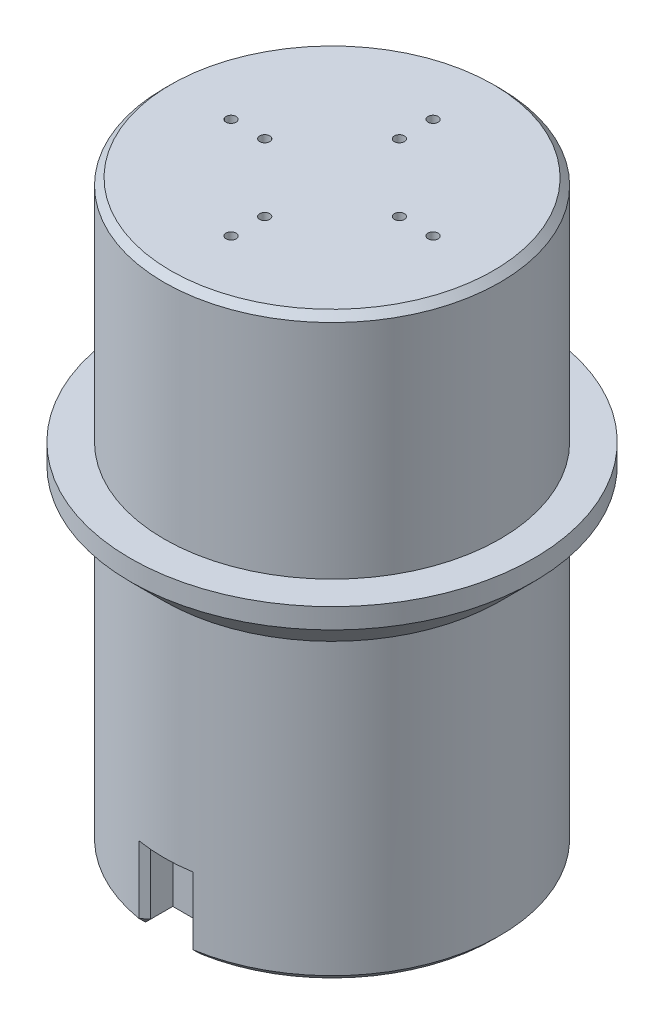
ISO-10303-21;
HEADER;
FILE_DESCRIPTION(('STEP AP214'),'2;1');
FILE_NAME('part.step','',(''),(''),'','','');
FILE_SCHEMA(('AUTOMOTIVE_DESIGN { 1 0 10303 214 1 1 1 1 }'));
ENDSEC;
DATA;
#1=APPLICATION_CONTEXT('core data for automotive mechanical design processes');
#2=APPLICATION_PROTOCOL_DEFINITION('international standard','automotive_design',2000,#1);
#3=PRODUCT_CONTEXT('',#1,'mechanical');
#4=PRODUCT('Part','Part','',(#3));
#5=PRODUCT_RELATED_PRODUCT_CATEGORY('part','',(#4));
#6=PRODUCT_DEFINITION_FORMATION('','',#4);
#7=PRODUCT_DEFINITION_CONTEXT('part definition',#1,'design');
#8=PRODUCT_DEFINITION('design','',#6,#7);
#9=PRODUCT_DEFINITION_SHAPE('','',#8);
#10=(LENGTH_UNIT() NAMED_UNIT(*) SI_UNIT(.MILLI.,.METRE.));
#11=(NAMED_UNIT(*) PLANE_ANGLE_UNIT() SI_UNIT($,.RADIAN.));
#12=(NAMED_UNIT(*) SI_UNIT($,.STERADIAN.) SOLID_ANGLE_UNIT());
#13=UNCERTAINTY_MEASURE_WITH_UNIT(LENGTH_MEASURE(1.E-05),#10,'distance_accuracy_value','');
#14=(GEOMETRIC_REPRESENTATION_CONTEXT(3) GLOBAL_UNCERTAINTY_ASSIGNED_CONTEXT((#13)) GLOBAL_UNIT_ASSIGNED_CONTEXT((#10,
#11,#12)) REPRESENTATION_CONTEXT('',''));
#15=CARTESIAN_POINT('',(0.,0.,0.));
#16=DIRECTION('',(0.,0.,1.));
#17=DIRECTION('',(1.,0.,0.));
#18=AXIS2_PLACEMENT_3D('',#15,#16,#17);
#19=CARTESIAN_POINT('',(0.,86.,0.));
#20=DIRECTION('',(0.,-1.,0.));
#21=DIRECTION('',(0.,0.,-1.));
#22=AXIS2_PLACEMENT_3D('',#19,#20,#21);
#23=CYLINDRICAL_SURFACE('',#22,24.95);
#24=CARTESIAN_POINT('',(0.,11.,0.));
#25=DIRECTION('',(0.,-1.,0.));
#26=DIRECTION('',(0.,0.,-1.));
#27=AXIS2_PLACEMENT_3D('',#24,#25,#26);
#28=CIRCLE('',#27,24.95);
#29=CARTESIAN_POINT('',(3.97470140287937,11.,24.6313671719202));
#30=VERTEX_POINT('',#29);
#31=CARTESIAN_POINT('',(-4.0707226193071,11.,24.6156803147234));
#32=VERTEX_POINT('',#31);
#33=EDGE_CURVE('E162',#30,#32,#28,.T.);
#34=ORIENTED_EDGE('',*,*,#33,.F.);
#35=DIRECTION('',(0.,-1.,0.));
#36=VECTOR('',#35,1.);
#37=CARTESIAN_POINT('',(3.97470140287937,86.,24.6313671719202));
#38=LINE('',#37,#36);
#39=CARTESIAN_POINT('',(3.97470140287937,1.00000000000001,24.6313671719202));
#40=VERTEX_POINT('',#39);
#41=EDGE_CURVE('E670',#30,#40,#38,.T.);
#42=ORIENTED_EDGE('',*,*,#41,.T.);
#43=CARTESIAN_POINT('',(0.,1.00000000000001,0.));
#44=DIRECTION('',(0.,1.,0.));
#45=DIRECTION('',(0.,0.,1.));
#46=AXIS2_PLACEMENT_3D('',#43,#44,#45);
#47=CIRCLE('',#46,24.95);
#48=CARTESIAN_POINT('',(-4.0707226193071,1.00000000000001,24.6156803147234));
#49=VERTEX_POINT('',#48);
#50=EDGE_CURVE('E815',#40,#49,#47,.T.);
#51=ORIENTED_EDGE('',*,*,#50,.T.);
#52=DIRECTION('',(0.,-1.,0.));
#53=VECTOR('',#52,1.);
#54=CARTESIAN_POINT('',(-4.07072261930711,86.,24.6156803147234));
#55=LINE('',#54,#53);
#56=EDGE_CURVE('E811',#49,#32,#55,.F.);
#57=ORIENTED_EDGE('',*,*,#56,.T.);
#58=EDGE_LOOP('',(#34,#42,#51,#57));
#59=FACE_BOUND('',#58,.T.);
#60=DIRECTION('',(0.,-1.,0.));
#61=VECTOR('',#60,1.);
#62=CARTESIAN_POINT('',(2.9,49.,-24.7808898145325));
#63=LINE('',#62,#61);
#64=CARTESIAN_POINT('',(2.9,44.,-24.7808898145325));
#65=VERTEX_POINT('',#64);
#66=CARTESIAN_POINT('',(2.9,29.2886751345948,-24.7808898145325));
#67=VERTEX_POINT('',#66);
#68=EDGE_CURVE('E141',#65,#67,#63,.T.);
#69=ORIENTED_EDGE('',*,*,#68,.F.);
#70=CARTESIAN_POINT('',(0.,44.,0.));
#71=DIRECTION('',(0.,1.,0.));
#72=DIRECTION('',(0.,0.,1.));
#73=AXIS2_PLACEMENT_3D('',#70,#71,#72);
#74=CIRCLE('',#73,24.95);
#75=CARTESIAN_POINT('',(-2.9,44.,-24.7808898145325));
#76=VERTEX_POINT('',#75);
#77=EDGE_CURVE('E152',#76,#65,#74,.T.);
#78=ORIENTED_EDGE('',*,*,#77,.F.);
#79=DIRECTION('',(0.,-1.,0.));
#80=VECTOR('',#79,1.);
#81=CARTESIAN_POINT('',(-2.9,49.,-24.7808898145325));
#82=LINE('',#81,#80);
#83=CARTESIAN_POINT('',(-2.9,29.2886751345948,-24.7808898145325));
#84=VERTEX_POINT('',#83);
#85=EDGE_CURVE('E148',#76,#84,#82,.T.);
#86=ORIENTED_EDGE('',*,*,#85,.T.);
#87=CARTESIAN_POINT('',(0.,14.9814217294158,0.));
#88=DIRECTION('',(0.,0.866025403784435,0.500000000000006));
#89=DIRECTION('',(0.,-0.500000000000006,0.866025403784435));
#90=AXIS2_PLACEMENT_3D('',#87,#88,#89);
#91=ELLIPSE('',#90,28.8097784325624,24.95);
#92=EDGE_CURVE('E11',#84,#67,#91,.F.);
#93=ORIENTED_EDGE('',*,*,#92,.T.);
#94=EDGE_LOOP('',(#69,#78,#86,#93));
#95=FACE_BOUND('',#94,.T.);
#96=ADVANCED_FACE('F41',(#59,#95),#23,.T.);
#97=CARTESIAN_POINT('',(0.,0.,0.));
#98=DIRECTION('',(0.,1.,0.));
#99=DIRECTION('',(0.,0.,1.));
#100=AXIS2_PLACEMENT_3D('',#97,#98,#99);
#101=PLANE('',#100);
#102=CARTESIAN_POINT('',(0.,0.,0.));
#103=DIRECTION('',(0.,1.,0.));
#104=DIRECTION('',(0.,0.,1.));
#105=AXIS2_PLACEMENT_3D('',#102,#103,#104);
#106=CIRCLE('',#105,23.95);
#107=CARTESIAN_POINT('',(-4.10000000000001,0.,23.5964510043354));
#108=VERTEX_POINT('',#107);
#109=CARTESIAN_POINT('',(4.10000000000001,0.,23.5964510043354));
#110=VERTEX_POINT('',#109);
#111=EDGE_CURVE('E800',#108,#110,#106,.F.);
#112=ORIENTED_EDGE('',*,*,#111,.T.);
#113=DIRECTION('',(0.,0.,-1.));
#114=VECTOR('',#113,1.);
#115=CARTESIAN_POINT('',(4.10000000000001,0.,0.));
#116=LINE('',#115,#114);
#117=CARTESIAN_POINT('',(4.10000000000001,0.,19.5566657690409));
#118=VERTEX_POINT('',#117);
#119=EDGE_CURVE('E676',#110,#118,#116,.T.);
#120=ORIENTED_EDGE('',*,*,#119,.T.);
#121=DIRECTION('',(-1.,0.,0.));
#122=VECTOR('',#121,1.);
#123=CARTESIAN_POINT('',(0.,0.,19.5566657690409));
#124=LINE('',#123,#122);
#125=CARTESIAN_POINT('',(-4.10000000000001,0.,19.5566657690409));
#126=VERTEX_POINT('',#125);
#127=EDGE_CURVE('E794',#118,#126,#124,.T.);
#128=ORIENTED_EDGE('',*,*,#127,.T.);
#129=DIRECTION('',(0.,0.,1.));
#130=VECTOR('',#129,1.);
#131=CARTESIAN_POINT('',(-4.10000000000001,0.,0.));
#132=LINE('',#131,#130);
#133=EDGE_CURVE('E797',#126,#108,#132,.T.);
#134=ORIENTED_EDGE('',*,*,#133,.T.);
#135=EDGE_LOOP('',(#112,#120,#128,#134));
#136=FACE_BOUND('',#135,.T.);
#137=ADVANCED_FACE('F268',(#136),#101,.F.);
#138=CARTESIAN_POINT('',(3.1,11.,20.5566657690409));
#139=DIRECTION('',(1.,0.,0.));
#140=DIRECTION('',(0.,0.,-1.));
#141=AXIS2_PLACEMENT_3D('',#138,#139,#140);
#142=PLANE('',#141);
#143=DIRECTION('',(0.,0.,1.));
#144=VECTOR('',#143,1.);
#145=CARTESIAN_POINT('',(3.1,1.00000000000001,20.5566657690409));
#146=LINE('',#145,#144);
#147=CARTESIAN_POINT('',(3.1,1.00000000000001,20.5566657690409));
#148=VERTEX_POINT('',#147);
#149=CARTESIAN_POINT('',(3.1,1.00000000000001,23.7566657690408));
#150=VERTEX_POINT('',#149);
#151=EDGE_CURVE('E663',#148,#150,#146,.T.);
#152=ORIENTED_EDGE('',*,*,#151,.T.);
#153=DIRECTION('',(0.,1.,0.));
#154=VECTOR('',#153,1.);
#155=CARTESIAN_POINT('',(3.1,11.,23.7566657690408));
#156=LINE('',#155,#154);
#157=CARTESIAN_POINT('',(3.1,11.,23.7566657690408));
#158=VERTEX_POINT('',#157);
#159=EDGE_CURVE('E667',#150,#158,#156,.T.);
#160=ORIENTED_EDGE('',*,*,#159,.T.);
#161=DIRECTION('',(0.,0.,1.));
#162=VECTOR('',#161,1.);
#163=CARTESIAN_POINT('',(3.1,11.,20.5566657690409));
#164=LINE('',#163,#162);
#165=CARTESIAN_POINT('',(3.1,11.,20.5566657690409));
#166=VERTEX_POINT('',#165);
#167=EDGE_CURVE('E176',#166,#158,#164,.T.);
#168=ORIENTED_EDGE('',*,*,#167,.F.);
#169=DIRECTION('',(0.,-1.,0.));
#170=VECTOR('',#169,1.);
#171=CARTESIAN_POINT('',(3.1,11.,20.5566657690409));
#172=LINE('',#171,#170);
#173=EDGE_CURVE('E181',#166,#148,#172,.T.);
#174=ORIENTED_EDGE('',*,*,#173,.T.);
#175=EDGE_LOOP('',(#152,#160,#168,#174));
#176=FACE_BOUND('',#175,.T.);
#177=ADVANCED_FACE('F275',(#176),#142,.F.);
#178=CARTESIAN_POINT('',(3.1,11.,20.5566657690409));
#179=DIRECTION('',(0.,0.,-1.));
#180=DIRECTION('',(-1.,0.,0.));
#181=AXIS2_PLACEMENT_3D('',#178,#179,#180);
#182=PLANE('',#181);
#183=DIRECTION('',(0.,-1.,0.));
#184=VECTOR('',#183,1.);
#185=CARTESIAN_POINT('',(-3.1,11.,20.5566657690409));
#186=LINE('',#185,#184);
#187=CARTESIAN_POINT('',(-3.1,11.,20.5566657690409));
#188=VERTEX_POINT('',#187);
#189=CARTESIAN_POINT('',(-3.1,1.00000000000001,20.5566657690409));
#190=VERTEX_POINT('',#189);
#191=EDGE_CURVE('E180',#188,#190,#186,.T.);
#192=ORIENTED_EDGE('',*,*,#191,.T.);
#193=DIRECTION('',(1.,0.,0.));
#194=VECTOR('',#193,1.);
#195=CARTESIAN_POINT('',(3.1,1.00000000000001,20.5566657690409));
#196=LINE('',#195,#194);
#197=EDGE_CURVE('E790',#190,#148,#196,.T.);
#198=ORIENTED_EDGE('',*,*,#197,.T.);
#199=ORIENTED_EDGE('',*,*,#173,.F.);
#200=DIRECTION('',(1.,0.,0.));
#201=VECTOR('',#200,1.);
#202=CARTESIAN_POINT('',(3.1,11.,20.5566657690409));
#203=LINE('',#202,#201);
#204=EDGE_CURVE('E172',#188,#166,#203,.T.);
#205=ORIENTED_EDGE('',*,*,#204,.F.);
#206=EDGE_LOOP('',(#192,#198,#199,#205));
#207=FACE_BOUND('',#206,.T.);
#208=ADVANCED_FACE('F633',(#207),#182,.F.);
#209=CARTESIAN_POINT('',(-3.1,11.,20.5566657690409));
#210=DIRECTION('',(-1.,0.,0.));
#211=DIRECTION('',(0.,0.,1.));
#212=AXIS2_PLACEMENT_3D('',#209,#210,#211);
#213=PLANE('',#212);
#214=DIRECTION('',(0.,0.,-1.));
#215=VECTOR('',#214,1.);
#216=CARTESIAN_POINT('',(-3.1,11.,20.5566657690409));
#217=LINE('',#216,#215);
#218=CARTESIAN_POINT('',(-3.1,11.,23.8610094041744));
#219=VERTEX_POINT('',#218);
#220=EDGE_CURVE('E166',#219,#188,#217,.T.);
#221=ORIENTED_EDGE('',*,*,#220,.F.);
#222=DIRECTION('',(0.,-1.,0.));
#223=VECTOR('',#222,1.);
#224=CARTESIAN_POINT('',(-3.1,11.,23.8610094041744));
#225=LINE('',#224,#223);
#226=CARTESIAN_POINT('',(-3.1,1.00000000000001,23.8610094041744));
#227=VERTEX_POINT('',#226);
#228=EDGE_CURVE('E803',#219,#227,#225,.T.);
#229=ORIENTED_EDGE('',*,*,#228,.T.);
#230=DIRECTION('',(0.,0.,-1.));
#231=VECTOR('',#230,1.);
#232=CARTESIAN_POINT('',(-3.1,1.00000000000001,20.5566657690409));
#233=LINE('',#232,#231);
#234=EDGE_CURVE('E689',#227,#190,#233,.T.);
#235=ORIENTED_EDGE('',*,*,#234,.T.);
#236=ORIENTED_EDGE('',*,*,#191,.F.);
#237=EDGE_LOOP('',(#221,#229,#235,#236));
#238=FACE_BOUND('',#237,.T.);
#239=ADVANCED_FACE('F623',(#238),#213,.F.);
#240=CARTESIAN_POINT('',(0.,11.,0.));
#241=DIRECTION('',(0.,-1.,0.));
#242=DIRECTION('',(0.,0.,-1.));
#243=AXIS2_PLACEMENT_3D('',#240,#241,#242);
#244=PLANE('',#243);
#245=ORIENTED_EDGE('',*,*,#33,.T.);
#246=DIRECTION('',(-0.789484459580598,0.,0.613770550027232));
#247=VECTOR('',#246,1.);
#248=CARTESIAN_POINT('',(-3.1,11.,23.8610094041744));
#249=LINE('',#248,#247);
#250=EDGE_CURVE('E695',#32,#219,#249,.F.);
#251=ORIENTED_EDGE('',*,*,#250,.T.);
#252=ORIENTED_EDGE('',*,*,#220,.T.);
#253=ORIENTED_EDGE('',*,*,#204,.T.);
#254=ORIENTED_EDGE('',*,*,#167,.T.);
#255=DIRECTION('',(-0.707106781186547,0.,-0.707106781186548));
#256=VECTOR('',#255,1.);
#257=CARTESIAN_POINT('',(3.97470140287937,11.,24.6313671719202));
#258=LINE('',#257,#256);
#259=EDGE_CURVE('E687',#158,#30,#258,.F.);
#260=ORIENTED_EDGE('',*,*,#259,.T.);
#261=EDGE_LOOP('',(#245,#251,#252,#253,#254,#260));
#262=FACE_BOUND('',#261,.T.);
#263=ADVANCED_FACE('F582',(#262),#244,.T.);
#264=CARTESIAN_POINT('',(2.9,49.,-28.2808898145325));
#265=DIRECTION('',(-1.,0.,0.));
#266=DIRECTION('',(0.,0.,1.));
#267=AXIS2_PLACEMENT_3D('',#264,#265,#266);
#268=PLANE('',#267);
#269=ORIENTED_EDGE('',*,*,#68,.T.);
#270=DIRECTION('',(0.,-0.500000000000006,0.866025403784435));
#271=VECTOR('',#270,1.);
#272=CARTESIAN_POINT('',(2.9,31.3094010767586,-28.2808898145325));
#273=LINE('',#272,#271);
#274=CARTESIAN_POINT('',(2.9,30.7320508075689,-27.2808898145325));
#275=VERTEX_POINT('',#274);
#276=EDGE_CURVE('E776',#67,#275,#273,.F.);
#277=ORIENTED_EDGE('',*,*,#276,.T.);
#278=DIRECTION('',(0.,1.,0.));
#279=VECTOR('',#278,1.);
#280=CARTESIAN_POINT('',(2.9,49.,-27.2808898145325));
#281=LINE('',#280,#279);
#282=CARTESIAN_POINT('',(2.9,46.4845940205475,-27.2808898145251));
#283=VERTEX_POINT('',#282);
#284=EDGE_CURVE('E144',#275,#283,#281,.T.);
#285=ORIENTED_EDGE('',*,*,#284,.T.);
#286=CARTESIAN_POINT('',(2.9,53.556444858784,-34.3843676223993));
#287=CARTESIAN_POINT('',(2.9,52.2541047529999,-33.0773473405722));
#288=CARTESIAN_POINT('',(2.9,50.9519753698081,-31.7701166065304));
#289=CARTESIAN_POINT('',(2.9,48.3484866656188,-29.1548910123965));
#290=CARTESIAN_POINT('',(2.9,47.0471273439089,-27.8468961530136));
#291=CARTESIAN_POINT('',(2.9,45.0959250306296,-25.8840710053353));
#292=CARTESIAN_POINT('',(2.9,44.4456634401724,-25.2296568800688));
#293=CARTESIAN_POINT('',(2.9,43.1454992786639,-23.9204721865201));
#294=CARTESIAN_POINT('',(2.9,42.4955967075796,-23.2657016182705));
#295=CARTESIAN_POINT('',(2.9,41.1962449233754,-21.9557094981714));
#296=CARTESIAN_POINT('',(2.9,40.546795710678,-21.3004879459025));
#297=CARTESIAN_POINT('',(2.9,39.2485066303363,-19.9894410599533));
#298=CARTESIAN_POINT('',(2.9,38.599666762886,-19.3336157260807));
#299=CARTESIAN_POINT('',(2.9,37.9512094657125,-18.6774120066656));
#300=B_SPLINE_CURVE_WITH_KNOTS('',3,(#286,#287,#288,#289,#290,#291,#292,#293,#294,#295,#296,
#297,#298,#299),.UNSPECIFIED.,.F.,.F.,(4,2,2,2,2,2,4),(0.,5.53529870949727,11.0705922897454,
13.8382413306825,16.6058901177351,19.3735414811869,22.1411937261286),.UNSPECIFIED.);
#301=EDGE_CURVE('E138',#283,#65,#300,.T.);
#302=ORIENTED_EDGE('',*,*,#301,.T.);
#303=EDGE_LOOP('',(#269,#277,#285,#302));
#304=FACE_BOUND('',#303,.T.);
#305=ADVANCED_FACE('F140',(#304),#268,.F.);
#306=CARTESIAN_POINT('',(2.9,49.,-28.2808898145325));
#307=DIRECTION('',(0.,0.,1.));
#308=DIRECTION('',(1.,0.,0.));
#309=AXIS2_PLACEMENT_3D('',#306,#307,#308);
#310=PLANE('',#309);
#311=DIRECTION('',(0.,-1.,0.));
#312=VECTOR('',#311,1.);
#313=CARTESIAN_POINT('',(1.89999999999998,49.,-28.2808898145325));
#314=LINE('',#313,#312);
#315=CARTESIAN_POINT('',(1.90000000000212,47.3946419751906,-28.2808898145325));
#316=VERTEX_POINT('',#315);
#317=CARTESIAN_POINT('',(1.89999999999998,31.3094010767586,-28.2808898145325));
#318=VERTEX_POINT('',#317);
#319=EDGE_CURVE('E756',#316,#318,#314,.T.);
#320=ORIENTED_EDGE('',*,*,#319,.T.);
#321=DIRECTION('',(-1.,0.,0.));
#322=VECTOR('',#321,1.);
#323=CARTESIAN_POINT('',(2.9,31.3094010767586,-28.2808898145325));
#324=LINE('',#323,#322);
#325=CARTESIAN_POINT('',(-1.89999999999999,31.3094010767586,-28.2808898145325));
#326=VERTEX_POINT('',#325);
#327=EDGE_CURVE('E768',#318,#326,#324,.T.);
#328=ORIENTED_EDGE('',*,*,#327,.T.);
#329=DIRECTION('',(0.,1.,0.));
#330=VECTOR('',#329,1.);
#331=CARTESIAN_POINT('',(-1.89999999999999,49.,-28.2808898145325));
#332=LINE('',#331,#330);
#333=CARTESIAN_POINT('',(-1.90000000000275,47.3946419751906,-28.2808898145325));
#334=VERTEX_POINT('',#333);
#335=EDGE_CURVE('E759',#326,#334,#332,.T.);
#336=ORIENTED_EDGE('',*,*,#335,.T.);
#337=CARTESIAN_POINT('',(-10.5578758876307,49.2373727237125,-28.2808898145325));
#338=CARTESIAN_POINT('',(-10.114575622107,49.0823237003253,-28.2808898145325));
#339=CARTESIAN_POINT('',(-9.66854931203622,48.9349047757572,-28.2808898145325));
#340=CARTESIAN_POINT('',(-8.77117712424843,48.6567620852664,-28.2808898145325));
#341=CARTESIAN_POINT('',(-8.31982962925329,48.5260435458835,-28.2808898145325));
#342=CARTESIAN_POINT('',(-7.41131817103999,48.2825923194211,-28.2808898145325));
#343=CARTESIAN_POINT('',(-6.95414438955198,48.1698960841263,-28.2808898145325));
#344=CARTESIAN_POINT('',(-6.03540524384912,47.9642603625372,-28.2808898145325));
#345=CARTESIAN_POINT('',(-5.57384032116309,47.8713189113851,-28.2808898145325));
#346=CARTESIAN_POINT('',(-4.66171518312825,47.7091238450711,-28.2808898145325));
#347=CARTESIAN_POINT('',(-4.21127274748553,47.6392099984229,-28.2808898145325));
#348=CARTESIAN_POINT('',(-3.30765629847615,47.5201381296687,-28.2808898145325));
#349=CARTESIAN_POINT('',(-2.85448238393614,47.4709793611487,-28.2808898145325));
#350=CARTESIAN_POINT('',(-1.94676743597238,47.394211683242,-28.2808898145325));
#351=CARTESIAN_POINT('',(-1.49222824977218,47.366581019651,-28.2808898145325));
#352=CARTESIAN_POINT('',(-0.582350186678118,47.333231616921,-28.2808898145325));
#353=CARTESIAN_POINT('',(-0.127011326835951,47.327512416099,-28.2808898145325));
#354=CARTESIAN_POINT('',(0.756938817798762,47.337768694229,-28.2808898145325));
#355=CARTESIAN_POINT('',(1.18556507249829,47.352502331097,-28.2808898145325));
#356=CARTESIAN_POINT('',(2.04171330579476,47.4012728347106,-28.2808898145325));
#357=CARTESIAN_POINT('',(2.46923528995444,47.4353096040257,-28.2808898145325));
#358=CARTESIAN_POINT('',(3.32272633761798,47.522246921822,-28.2808898145325));
#359=CARTESIAN_POINT('',(3.74869371822032,47.5751639236844,-28.2808898145325));
#360=CARTESIAN_POINT('',(4.59798178424339,47.6991476746975,-28.2808898145325));
#361=CARTESIAN_POINT('',(5.02130238632381,47.7702149924362,-28.2808898145325));
#362=CARTESIAN_POINT('',(5.87775875096678,47.9320790828971,-28.2808898145325));
#363=CARTESIAN_POINT('',(6.31079144376571,48.0234196655595,-28.2808898145325));
#364=CARTESIAN_POINT('',(7.17288415828488,48.2233293625913,-28.2808898145325));
#365=CARTESIAN_POINT('',(7.60194386057906,48.3318998497225,-28.2808898145325));
#366=CARTESIAN_POINT('',(8.45489357885723,48.5648427710272,-28.2808898145325));
#367=CARTESIAN_POINT('',(8.87879157928109,48.6891861002662,-28.2808898145325));
#368=CARTESIAN_POINT('',(9.72188546269634,48.9525648082947,-28.2808898145325));
#369=CARTESIAN_POINT('',(10.141082528186,49.0915963962617,-28.2808898145325));
#370=CARTESIAN_POINT('',(10.5578758876307,49.2373727237125,-28.2808898145325));
#371=B_SPLINE_CURVE_WITH_KNOTS('',3,(#337,#338,#339,#340,#341,#342,#343,#344,#345,#346,#347,
#348,#349,#350,#351,#352,#353,#354,#355,#356,#357,#358,#359,#360,#361,#362,#363,#364,#365,#366,
#367,#368,#369,#370),.UNSPECIFIED.,.F.,.F.,(4,2,2,2,2,2,2,2,2,2,2,2,2,2,2,2,4),(0.,
1.40891032067437,2.81826049833348,4.23042611772559,5.64245121397537,7.00949887554376,
8.3764973698416,9.74211271068359,11.1076992773177,12.3939006550598,13.6800955409005,
14.9674140438476,16.2547728790765,17.5820812232537,18.9094953714808,20.2344947928186,
21.559153082925),.UNSPECIFIED.);
#372=EDGE_CURVE('E149',#334,#316,#371,.T.);
#373=ORIENTED_EDGE('',*,*,#372,.T.);
#374=EDGE_LOOP('',(#320,#328,#336,#373));
#375=FACE_BOUND('',#374,.T.);
#376=ADVANCED_FACE('F565',(#375),#310,.F.);
#377=CARTESIAN_POINT('',(-2.9,49.,-28.2808898145325));
#378=DIRECTION('',(1.,0.,0.));
#379=DIRECTION('',(0.,0.,-1.));
#380=AXIS2_PLACEMENT_3D('',#377,#378,#379);
#381=PLANE('',#380);
#382=DIRECTION('',(0.,-1.,0.));
#383=VECTOR('',#382,1.);
#384=CARTESIAN_POINT('',(-2.9,49.,-27.2808898145325));
#385=LINE('',#384,#383);
#386=CARTESIAN_POINT('',(-2.9,46.4845940205548,-27.2808898145325));
#387=VERTEX_POINT('',#386);
#388=CARTESIAN_POINT('',(-2.9,30.7320508075689,-27.2808898145325));
#389=VERTEX_POINT('',#388);
#390=EDGE_CURVE('E752',#387,#389,#385,.T.);
#391=ORIENTED_EDGE('',*,*,#390,.T.);
#392=DIRECTION('',(0.,0.500000000000006,-0.866025403784435));
#393=VECTOR('',#392,1.);
#394=CARTESIAN_POINT('',(-2.9,31.3094010767586,-28.2808898145325));
#395=LINE('',#394,#393);
#396=EDGE_CURVE('E772',#389,#84,#395,.F.);
#397=ORIENTED_EDGE('',*,*,#396,.T.);
#398=ORIENTED_EDGE('',*,*,#85,.F.);
#399=CARTESIAN_POINT('',(-2.9,37.9512094657125,-18.6774120066656));
#400=CARTESIAN_POINT('',(-2.9,38.599666762886,-19.3336157260807));
#401=CARTESIAN_POINT('',(-2.9,39.2485066303363,-19.9894410599533));
#402=CARTESIAN_POINT('',(-2.9,40.546795710678,-21.3004879459025));
#403=CARTESIAN_POINT('',(-2.9,41.1962449233753,-21.9557094981714));
#404=CARTESIAN_POINT('',(-2.9,42.4955967075796,-23.2657016182705));
#405=CARTESIAN_POINT('',(-2.9,43.1454992786639,-23.9204721865201));
#406=CARTESIAN_POINT('',(-2.9,44.4456634401725,-25.2296568800688));
#407=CARTESIAN_POINT('',(-2.9,45.0959250306296,-25.8840710053353));
#408=CARTESIAN_POINT('',(-2.9,47.0471273439089,-27.8468961530136));
#409=CARTESIAN_POINT('',(-2.9,48.3484866656188,-29.1548910123965));
#410=CARTESIAN_POINT('',(-2.9,50.9519753698081,-31.7701166065304));
#411=CARTESIAN_POINT('',(-2.9,52.2541047529999,-33.0773473405722));
#412=CARTESIAN_POINT('',(-2.9,53.556444858784,-34.3843676223993));
#413=B_SPLINE_CURVE_WITH_KNOTS('',3,(#399,#400,#401,#402,#403,#404,#405,#406,#407,#408,#409,
#410,#411,#412),.UNSPECIFIED.,.F.,.F.,(4,2,2,2,2,2,4),(0.,2.76765224494172,5.53530360839353,
8.30295239544613,11.0706014363832,16.6058950166314,22.1411937261286),.UNSPECIFIED.);
#414=EDGE_CURVE('E155',#76,#387,#413,.T.);
#415=ORIENTED_EDGE('',*,*,#414,.T.);
#416=EDGE_LOOP('',(#391,#397,#398,#415));
#417=FACE_BOUND('',#416,.T.);
#418=ADVANCED_FACE('F198',(#417),#381,.F.);
#419=CARTESIAN_POINT('',(0.,49.,0.));
#420=DIRECTION('',(0.,1.,0.));
#421=DIRECTION('',(0.,0.,1.));
#422=AXIS2_PLACEMENT_3D('',#419,#420,#421);
#423=CONICAL_SURFACE('',#422,29.95,0.785398163397449);
#424=CARTESIAN_POINT('',(0.,49.,0.));
#425=DIRECTION('',(0.,1.,0.));
#426=DIRECTION('',(0.,0.,1.));
#427=AXIS2_PLACEMENT_3D('',#424,#425,#426);
#428=CIRCLE('',#427,29.95);
#429=CARTESIAN_POINT('',(0.,49.,29.95));
#430=VERTEX_POINT('',#429);
#431=EDGE_CURVE('E159',#430,#430,#428,.T.);
#432=ORIENTED_EDGE('',*,*,#431,.F.);
#433=EDGE_LOOP('',(#432));
#434=FACE_BOUND('',#433,.T.);
#435=ORIENTED_EDGE('',*,*,#301,.F.);
#436=CARTESIAN_POINT('',(2.9,46.4845940205401,-27.2808898145325));
#437=CARTESIAN_POINT('',(2.81609213577608,46.5591624380031,-27.3647976787564));
#438=CARTESIAN_POINT('',(2.73233263066825,46.6340644520412,-27.4485571838642));
#439=CARTESIAN_POINT('',(2.56510507727385,46.7845092594618,-27.6157847372586));
#440=CARTESIAN_POINT('',(2.48163702100853,46.8600520351055,-27.6992527935239));
#441=CARTESIAN_POINT('',(2.31498258879029,47.0117559654224,-27.8659072257422));
#442=CARTESIAN_POINT('',(2.23179621244941,47.0879171192434,-27.9490936020831));
#443=CARTESIAN_POINT('',(2.06569540006063,47.2408373126483,-28.1151944144718));
#444=CARTESIAN_POINT('',(1.98278097158013,47.3175963686727,-28.1981088429523));
#445=CARTESIAN_POINT('',(1.90000000000061,47.3946419751898,-28.2808898145319));
#446=B_SPLINE_CURVE_WITH_KNOTS('',3,(#436,#437,#438,#439,#440,#441,#442,#443,#444,#445),
.UNSPECIFIED.,.F.,.F.,(4,2,2,2,4),(0.,0.420443723771166,0.840875845713292,1.26130738834775,
1.68175053258939),.UNSPECIFIED.);
#447=EDGE_CURVE('E236',#283,#316,#446,.T.);
#448=ORIENTED_EDGE('',*,*,#447,.T.);
#449=ORIENTED_EDGE('',*,*,#372,.F.);
#450=CARTESIAN_POINT('',(-1.89999999999999,47.3946419751906,-28.2808898145325));
#451=CARTESIAN_POINT('',(-1.982780971579,47.3175963686734,-28.1981088429535));
#452=CARTESIAN_POINT('',(-2.06569540005921,47.2408373126495,-28.1151944144733));
#453=CARTESIAN_POINT('',(-2.23179621244743,47.0879171192454,-27.949093602085));
#454=CARTESIAN_POINT('',(-2.31498258878805,47.0117559654249,-27.8659072257444));
#455=CARTESIAN_POINT('',(-2.48163702100535,46.860052035108,-27.6992527935271));
#456=CARTESIAN_POINT('',(-2.56510507727,46.7845092594638,-27.6157847372625));
#457=CARTESIAN_POINT('',(-2.73233263066465,46.6340644520458,-27.4485571838678));
#458=CARTESIAN_POINT('',(-2.8160921357734,46.5591624380108,-27.3647976787591));
#459=CARTESIAN_POINT('',(-2.9,46.4845940205548,-27.2808898145325));
#460=B_SPLINE_CURVE_WITH_KNOTS('',3,(#450,#451,#452,#453,#454,#455,#456,#457,#458,#459),
.UNSPECIFIED.,.F.,.F.,(4,2,2,2,4),(0.,0.420443144239958,0.840874686872696,1.26130680881315,
1.68175053258268),.UNSPECIFIED.);
#461=EDGE_CURVE('E228',#334,#387,#460,.T.);
#462=ORIENTED_EDGE('',*,*,#461,.T.);
#463=ORIENTED_EDGE('',*,*,#414,.F.);
#464=ORIENTED_EDGE('',*,*,#77,.T.);
#465=EDGE_LOOP('',(#435,#448,#449,#462,#463,#464));
#466=FACE_BOUND('',#465,.T.);
#467=ADVANCED_FACE('F153',(#434,#466),#423,.T.);
#468=CARTESIAN_POINT('',(0.,86.,0.));
#469=DIRECTION('',(0.,1.,0.));
#470=DIRECTION('',(0.,0.,1.));
#471=AXIS2_PLACEMENT_3D('',#468,#469,#470);
#472=CYLINDRICAL_SURFACE('',#471,29.95);
#473=ORIENTED_EDGE('',*,*,#431,.T.);
#474=EDGE_LOOP('',(#473));
#475=FACE_BOUND('',#474,.T.);
#476=CARTESIAN_POINT('',(0.,52.,0.));
#477=DIRECTION('',(0.,1.,0.));
#478=DIRECTION('',(0.,0.,1.));
#479=AXIS2_PLACEMENT_3D('',#476,#477,#478);
#480=CIRCLE('',#479,29.95);
#481=CARTESIAN_POINT('',(0.,52.,29.95));
#482=VERTEX_POINT('',#481);
#483=EDGE_CURVE('E298',#482,#482,#480,.T.);
#484=ORIENTED_EDGE('',*,*,#483,.F.);
#485=EDGE_LOOP('',(#484));
#486=FACE_BOUND('',#485,.T.);
#487=ADVANCED_FACE('F206',(#475,#486),#472,.T.);
#488=CARTESIAN_POINT('',(-29.95,52.,0.));
#489=DIRECTION('',(0.,1.,0.));
#490=DIRECTION('',(0.,0.,1.));
#491=AXIS2_PLACEMENT_3D('',#488,#489,#490);
#492=PLANE('',#491);
#493=ORIENTED_EDGE('',*,*,#483,.T.);
#494=EDGE_LOOP('',(#493));
#495=FACE_BOUND('',#494,.T.);
#496=CARTESIAN_POINT('',(0.,52.,0.));
#497=DIRECTION('',(0.,1.,0.));
#498=DIRECTION('',(0.,0.,1.));
#499=AXIS2_PLACEMENT_3D('',#496,#497,#498);
#500=CIRCLE('',#499,24.95);
#501=CARTESIAN_POINT('',(0.,52.,24.95));
#502=VERTEX_POINT('',#501);
#503=EDGE_CURVE('E158',#502,#502,#500,.T.);
#504=ORIENTED_EDGE('',*,*,#503,.F.);
#505=EDGE_LOOP('',(#504));
#506=FACE_BOUND('',#505,.T.);
#507=ADVANCED_FACE('F210',(#495,#506),#492,.T.);
#508=CARTESIAN_POINT('',(0.,86.,0.));
#509=DIRECTION('',(0.,1.,0.));
#510=DIRECTION('',(0.,0.,1.));
#511=AXIS2_PLACEMENT_3D('',#508,#509,#510);
#512=PLANE('',#511);
#513=CARTESIAN_POINT('',(0.,86.,0.));
#514=DIRECTION('',(0.,1.,0.));
#515=DIRECTION('',(0.,0.,1.));
#516=AXIS2_PLACEMENT_3D('',#513,#514,#515);
#517=CIRCLE('',#516,23.95);
#518=CARTESIAN_POINT('',(0.,86.,23.95));
#519=VERTEX_POINT('',#518);
#520=EDGE_CURVE('E196',#519,#519,#517,.T.);
#521=ORIENTED_EDGE('',*,*,#520,.T.);
#522=EDGE_LOOP('',(#521));
#523=FACE_BOUND('',#522,.T.);
#524=CARTESIAN_POINT('',(-15.,86.,-1.58335183813093E-13));
#525=DIRECTION('',(0.,1.,0.));
#526=DIRECTION('',(1.,0.,0.));
#527=AXIS2_PLACEMENT_3D('',#524,#525,#526);
#528=CIRCLE('',#527,0.75);
#529=CARTESIAN_POINT('',(-14.25,86.,-1.50479350800696E-13));
#530=VERTEX_POINT('',#529);
#531=EDGE_CURVE('E331',#530,#530,#528,.T.);
#532=ORIENTED_EDGE('',*,*,#531,.F.);
#533=EDGE_LOOP('',(#532));
#534=FACE_BOUND('',#533,.T.);
#535=CARTESIAN_POINT('',(15.,86.,0.));
#536=DIRECTION('',(0.,1.,0.));
#537=DIRECTION('',(-1.,0.,0.));
#538=AXIS2_PLACEMENT_3D('',#535,#536,#537);
#539=CIRCLE('',#538,0.75);
#540=CARTESIAN_POINT('',(14.25,86.,0.));
#541=VERTEX_POINT('',#540);
#542=EDGE_CURVE('E350',#541,#541,#539,.T.);
#543=ORIENTED_EDGE('',*,*,#542,.F.);
#544=EDGE_LOOP('',(#543));
#545=FACE_BOUND('',#544,.T.);
#546=CARTESIAN_POINT('',(0.,86.,10.));
#547=DIRECTION('',(0.,1.,0.));
#548=DIRECTION('',(0.,0.,-1.));
#549=AXIS2_PLACEMENT_3D('',#546,#547,#548);
#550=CIRCLE('',#549,0.75);
#551=CARTESIAN_POINT('',(0.,86.,9.25));
#552=VERTEX_POINT('',#551);
#553=EDGE_CURVE('E341',#552,#552,#550,.T.);
#554=ORIENTED_EDGE('',*,*,#553,.F.);
#555=EDGE_LOOP('',(#554));
#556=FACE_BOUND('',#555,.T.);
#557=CARTESIAN_POINT('',(0.,86.,15.));
#558=DIRECTION('',(0.,1.,0.));
#559=DIRECTION('',(0.,0.,-1.));
#560=AXIS2_PLACEMENT_3D('',#557,#558,#559);
#561=CIRCLE('',#560,0.75);
#562=CARTESIAN_POINT('',(0.,86.,14.25));
#563=VERTEX_POINT('',#562);
#564=EDGE_CURVE('E364',#563,#563,#561,.T.);
#565=ORIENTED_EDGE('',*,*,#564,.F.);
#566=EDGE_LOOP('',(#565));
#567=FACE_BOUND('',#566,.T.);
#568=CARTESIAN_POINT('',(-10.,86.,-1.06575287130019E-13));
#569=DIRECTION('',(0.,1.,0.));
#570=DIRECTION('',(1.,0.,0.));
#571=AXIS2_PLACEMENT_3D('',#568,#569,#570);
#572=CIRCLE('',#571,0.75);
#573=CARTESIAN_POINT('',(-9.25,86.,0.));
#574=VERTEX_POINT('',#573);
#575=EDGE_CURVE('E340',#574,#574,#572,.T.);
#576=ORIENTED_EDGE('',*,*,#575,.F.);
#577=EDGE_LOOP('',(#576));
#578=FACE_BOUND('',#577,.T.);
#579=CARTESIAN_POINT('',(10.,86.,0.));
#580=DIRECTION('',(0.,1.,0.));
#581=DIRECTION('',(-1.,0.,0.));
#582=AXIS2_PLACEMENT_3D('',#579,#580,#581);
#583=CIRCLE('',#582,0.75);
#584=CARTESIAN_POINT('',(9.25,86.,0.));
#585=VERTEX_POINT('',#584);
#586=EDGE_CURVE('E323',#585,#585,#583,.T.);
#587=ORIENTED_EDGE('',*,*,#586,.F.);
#588=EDGE_LOOP('',(#587));
#589=FACE_BOUND('',#588,.T.);
#590=CARTESIAN_POINT('',(0.,86.,-10.));
#591=DIRECTION('',(0.,1.,0.));
#592=DIRECTION('',(0.,0.,1.));
#593=AXIS2_PLACEMENT_3D('',#590,#591,#592);
#594=CIRCLE('',#593,0.75);
#595=CARTESIAN_POINT('',(0.,86.,-9.25));
#596=VERTEX_POINT('',#595);
#597=EDGE_CURVE('E316',#596,#596,#594,.T.);
#598=ORIENTED_EDGE('',*,*,#597,.F.);
#599=EDGE_LOOP('',(#598));
#600=FACE_BOUND('',#599,.T.);
#601=CARTESIAN_POINT('',(0.,86.,-15.));
#602=DIRECTION('',(0.,1.,0.));
#603=DIRECTION('',(0.,0.,1.));
#604=AXIS2_PLACEMENT_3D('',#601,#602,#603);
#605=CIRCLE('',#604,0.75);
#606=CARTESIAN_POINT('',(0.,86.,-14.25));
#607=VERTEX_POINT('',#606);
#608=EDGE_CURVE('E307',#607,#607,#605,.T.);
#609=ORIENTED_EDGE('',*,*,#608,.F.);
#610=EDGE_LOOP('',(#609));
#611=FACE_BOUND('',#610,.T.);
#612=ADVANCED_FACE('F280',(#523,#534,#545,#556,#567,#578,#589,#600,#611),#512,.T.);
#613=CARTESIAN_POINT('',(0.,85.,0.));
#614=DIRECTION('',(0.,1.,0.));
#615=DIRECTION('',(0.,0.,1.));
#616=AXIS2_PLACEMENT_3D('',#613,#614,#615);
#617=CIRCLE('',#616,24.95);
#618=CARTESIAN_POINT('',(0.,85.,24.95));
#619=VERTEX_POINT('',#618);
#620=EDGE_CURVE('E293',#619,#619,#617,.F.);
#621=ORIENTED_EDGE('',*,*,#620,.T.);
#622=EDGE_LOOP('',(#621));
#623=FACE_BOUND('',#622,.T.);
#624=ORIENTED_EDGE('',*,*,#503,.T.);
#625=EDGE_LOOP('',(#624));
#626=FACE_BOUND('',#625,.T.);
#627=ADVANCED_FACE('F271',(#623,#626),#23,.T.);
#628=CARTESIAN_POINT('',(0.,66.,-15.));
#629=DIRECTION('',(0.,1.,0.));
#630=DIRECTION('',(0.,0.,1.));
#631=AXIS2_PLACEMENT_3D('',#628,#629,#630);
#632=CYLINDRICAL_SURFACE('',#631,0.75);
#633=CARTESIAN_POINT('',(0.,66.,-15.));
#634=DIRECTION('',(0.,1.,0.));
#635=DIRECTION('',(0.,0.,1.));
#636=AXIS2_PLACEMENT_3D('',#633,#634,#635);
#637=CIRCLE('',#636,0.75);
#638=CARTESIAN_POINT('',(0.,66.,-14.25));
#639=VERTEX_POINT('',#638);
#640=EDGE_CURVE('E311',#639,#639,#637,.T.);
#641=ORIENTED_EDGE('',*,*,#640,.F.);
#642=EDGE_LOOP('',(#641));
#643=FACE_BOUND('',#642,.T.);
#644=ORIENTED_EDGE('',*,*,#608,.T.);
#645=EDGE_LOOP('',(#644));
#646=FACE_BOUND('',#645,.T.);
#647=ADVANCED_FACE('F208',(#643,#646),#632,.F.);
#648=CARTESIAN_POINT('',(0.,66.,-15.));
#649=DIRECTION('',(0.,1.,0.));
#650=DIRECTION('',(0.,0.,1.));
#651=AXIS2_PLACEMENT_3D('',#648,#649,#650);
#652=PLANE('',#651);
#653=ORIENTED_EDGE('',*,*,#640,.T.);
#654=EDGE_LOOP('',(#653));
#655=FACE_BOUND('',#654,.T.);
#656=ADVANCED_FACE('F286',(#655),#652,.T.);
#657=CARTESIAN_POINT('',(0.,66.,-10.));
#658=DIRECTION('',(0.,1.,0.));
#659=DIRECTION('',(0.,0.,1.));
#660=AXIS2_PLACEMENT_3D('',#657,#658,#659);
#661=CYLINDRICAL_SURFACE('',#660,0.75);
#662=CARTESIAN_POINT('',(0.,66.,-10.));
#663=DIRECTION('',(0.,1.,0.));
#664=DIRECTION('',(0.,0.,1.));
#665=AXIS2_PLACEMENT_3D('',#662,#663,#664);
#666=CIRCLE('',#665,0.75);
#667=CARTESIAN_POINT('',(0.,66.,-9.25));
#668=VERTEX_POINT('',#667);
#669=EDGE_CURVE('E306',#668,#668,#666,.T.);
#670=ORIENTED_EDGE('',*,*,#669,.F.);
#671=EDGE_LOOP('',(#670));
#672=FACE_BOUND('',#671,.T.);
#673=ORIENTED_EDGE('',*,*,#597,.T.);
#674=EDGE_LOOP('',(#673));
#675=FACE_BOUND('',#674,.T.);
#676=ADVANCED_FACE('F391',(#672,#675),#661,.F.);
#677=CARTESIAN_POINT('',(0.,66.,-10.));
#678=DIRECTION('',(0.,1.,0.));
#679=DIRECTION('',(0.,0.,1.));
#680=AXIS2_PLACEMENT_3D('',#677,#678,#679);
#681=PLANE('',#680);
#682=ORIENTED_EDGE('',*,*,#669,.T.);
#683=EDGE_LOOP('',(#682));
#684=FACE_BOUND('',#683,.T.);
#685=ADVANCED_FACE('F393',(#684),#681,.T.);
#686=CARTESIAN_POINT('',(10.,66.,0.));
#687=DIRECTION('',(0.,1.,0.));
#688=DIRECTION('',(0.,0.,1.));
#689=AXIS2_PLACEMENT_3D('',#686,#687,#688);
#690=CYLINDRICAL_SURFACE('',#689,0.75);
#691=CARTESIAN_POINT('',(10.,66.,0.));
#692=DIRECTION('',(0.,1.,0.));
#693=DIRECTION('',(-1.,0.,0.));
#694=AXIS2_PLACEMENT_3D('',#691,#692,#693);
#695=CIRCLE('',#694,0.75);
#696=CARTESIAN_POINT('',(9.25,66.,0.));
#697=VERTEX_POINT('',#696);
#698=EDGE_CURVE('E312',#697,#697,#695,.T.);
#699=ORIENTED_EDGE('',*,*,#698,.F.);
#700=EDGE_LOOP('',(#699));
#701=FACE_BOUND('',#700,.T.);
#702=ORIENTED_EDGE('',*,*,#586,.T.);
#703=EDGE_LOOP('',(#702));
#704=FACE_BOUND('',#703,.T.);
#705=ADVANCED_FACE('F400',(#701,#704),#690,.F.);
#706=CARTESIAN_POINT('',(10.,66.,0.));
#707=DIRECTION('',(0.,1.,0.));
#708=DIRECTION('',(-1.,0.,0.));
#709=AXIS2_PLACEMENT_3D('',#706,#707,#708);
#710=PLANE('',#709);
#711=ORIENTED_EDGE('',*,*,#698,.T.);
#712=EDGE_LOOP('',(#711));
#713=FACE_BOUND('',#712,.T.);
#714=ADVANCED_FACE('F408',(#713),#710,.T.);
#715=CARTESIAN_POINT('',(-10.,66.,-1.06575287130019E-13));
#716=DIRECTION('',(0.,1.,0.));
#717=DIRECTION('',(0.,0.,1.));
#718=AXIS2_PLACEMENT_3D('',#715,#716,#717);
#719=CYLINDRICAL_SURFACE('',#718,0.75);
#720=CARTESIAN_POINT('',(-10.,66.,-1.06575287130019E-13));
#721=DIRECTION('',(0.,1.,0.));
#722=DIRECTION('',(1.,0.,0.));
#723=AXIS2_PLACEMENT_3D('',#720,#721,#722);
#724=CIRCLE('',#723,0.75);
#725=CARTESIAN_POINT('',(-9.25,66.,0.));
#726=VERTEX_POINT('',#725);
#727=EDGE_CURVE('E360',#726,#726,#724,.T.);
#728=ORIENTED_EDGE('',*,*,#727,.F.);
#729=EDGE_LOOP('',(#728));
#730=FACE_BOUND('',#729,.T.);
#731=ORIENTED_EDGE('',*,*,#575,.T.);
#732=EDGE_LOOP('',(#731));
#733=FACE_BOUND('',#732,.T.);
#734=ADVANCED_FACE('F412',(#730,#733),#719,.F.);
#735=CARTESIAN_POINT('',(-10.,66.,-1.06575287130019E-13));
#736=DIRECTION('',(0.,1.,0.));
#737=DIRECTION('',(1.,0.,0.));
#738=AXIS2_PLACEMENT_3D('',#735,#736,#737);
#739=PLANE('',#738);
#740=ORIENTED_EDGE('',*,*,#727,.T.);
#741=EDGE_LOOP('',(#740));
#742=FACE_BOUND('',#741,.T.);
#743=ADVANCED_FACE('F377',(#742),#739,.T.);
#744=CARTESIAN_POINT('',(0.,66.,15.));
#745=DIRECTION('',(0.,1.,0.));
#746=DIRECTION('',(0.,0.,1.));
#747=AXIS2_PLACEMENT_3D('',#744,#745,#746);
#748=CYLINDRICAL_SURFACE('',#747,0.75);
#749=CARTESIAN_POINT('',(0.,66.,15.));
#750=DIRECTION('',(0.,1.,0.));
#751=DIRECTION('',(0.,0.,-1.));
#752=AXIS2_PLACEMENT_3D('',#749,#750,#751);
#753=CIRCLE('',#752,0.75);
#754=CARTESIAN_POINT('',(0.,66.,14.25));
#755=VERTEX_POINT('',#754);
#756=EDGE_CURVE('E346',#755,#755,#753,.T.);
#757=ORIENTED_EDGE('',*,*,#756,.F.);
#758=EDGE_LOOP('',(#757));
#759=FACE_BOUND('',#758,.T.);
#760=ORIENTED_EDGE('',*,*,#564,.T.);
#761=EDGE_LOOP('',(#760));
#762=FACE_BOUND('',#761,.T.);
#763=ADVANCED_FACE('F374',(#759,#762),#748,.F.);
#764=CARTESIAN_POINT('',(0.,66.,15.));
#765=DIRECTION('',(0.,1.,0.));
#766=DIRECTION('',(0.,0.,-1.));
#767=AXIS2_PLACEMENT_3D('',#764,#765,#766);
#768=PLANE('',#767);
#769=ORIENTED_EDGE('',*,*,#756,.T.);
#770=EDGE_LOOP('',(#769));
#771=FACE_BOUND('',#770,.T.);
#772=ADVANCED_FACE('F372',(#771),#768,.T.);
#773=CARTESIAN_POINT('',(0.,66.,10.));
#774=DIRECTION('',(0.,1.,0.));
#775=DIRECTION('',(0.,0.,1.));
#776=AXIS2_PLACEMENT_3D('',#773,#774,#775);
#777=CYLINDRICAL_SURFACE('',#776,0.75);
#778=CARTESIAN_POINT('',(0.,66.,10.));
#779=DIRECTION('',(0.,1.,0.));
#780=DIRECTION('',(0.,0.,-1.));
#781=AXIS2_PLACEMENT_3D('',#778,#779,#780);
#782=CIRCLE('',#781,0.75);
#783=CARTESIAN_POINT('',(0.,66.,9.25));
#784=VERTEX_POINT('',#783);
#785=EDGE_CURVE('E345',#784,#784,#782,.T.);
#786=ORIENTED_EDGE('',*,*,#785,.F.);
#787=EDGE_LOOP('',(#786));
#788=FACE_BOUND('',#787,.T.);
#789=ORIENTED_EDGE('',*,*,#553,.T.);
#790=EDGE_LOOP('',(#789));
#791=FACE_BOUND('',#790,.T.);
#792=ADVANCED_FACE('F424',(#788,#791),#777,.F.);
#793=CARTESIAN_POINT('',(0.,66.,10.));
#794=DIRECTION('',(0.,1.,0.));
#795=DIRECTION('',(0.,0.,-1.));
#796=AXIS2_PLACEMENT_3D('',#793,#794,#795);
#797=PLANE('',#796);
#798=ORIENTED_EDGE('',*,*,#785,.T.);
#799=EDGE_LOOP('',(#798));
#800=FACE_BOUND('',#799,.T.);
#801=ADVANCED_FACE('F427',(#800),#797,.T.);
#802=CARTESIAN_POINT('',(15.,66.,0.));
#803=DIRECTION('',(0.,1.,0.));
#804=DIRECTION('',(0.,0.,1.));
#805=AXIS2_PLACEMENT_3D('',#802,#803,#804);
#806=CYLINDRICAL_SURFACE('',#805,0.75);
#807=CARTESIAN_POINT('',(15.,66.,0.));
#808=DIRECTION('',(0.,1.,0.));
#809=DIRECTION('',(-1.,0.,0.));
#810=AXIS2_PLACEMENT_3D('',#807,#808,#809);
#811=CIRCLE('',#810,0.75);
#812=CARTESIAN_POINT('',(14.25,66.,0.));
#813=VERTEX_POINT('',#812);
#814=EDGE_CURVE('E327',#813,#813,#811,.T.);
#815=ORIENTED_EDGE('',*,*,#814,.F.);
#816=EDGE_LOOP('',(#815));
#817=FACE_BOUND('',#816,.T.);
#818=ORIENTED_EDGE('',*,*,#542,.T.);
#819=EDGE_LOOP('',(#818));
#820=FACE_BOUND('',#819,.T.);
#821=ADVANCED_FACE('F431',(#817,#820),#806,.F.);
#822=CARTESIAN_POINT('',(15.,66.,0.));
#823=DIRECTION('',(0.,1.,0.));
#824=DIRECTION('',(-1.,0.,0.));
#825=AXIS2_PLACEMENT_3D('',#822,#823,#824);
#826=PLANE('',#825);
#827=ORIENTED_EDGE('',*,*,#814,.T.);
#828=EDGE_LOOP('',(#827));
#829=FACE_BOUND('',#828,.T.);
#830=ADVANCED_FACE('F418',(#829),#826,.T.);
#831=CARTESIAN_POINT('',(-15.,66.,-1.58335183813093E-13));
#832=DIRECTION('',(0.,1.,0.));
#833=DIRECTION('',(0.,0.,1.));
#834=AXIS2_PLACEMENT_3D('',#831,#832,#833);
#835=CYLINDRICAL_SURFACE('',#834,0.75);
#836=CARTESIAN_POINT('',(-15.,66.,-1.58335183813093E-13));
#837=DIRECTION('',(0.,1.,0.));
#838=DIRECTION('',(1.,0.,0.));
#839=AXIS2_PLACEMENT_3D('',#836,#837,#838);
#840=CIRCLE('',#839,0.75);
#841=CARTESIAN_POINT('',(-14.25,66.,-1.50479350800696E-13));
#842=VERTEX_POINT('',#841);
#843=EDGE_CURVE('E335',#842,#842,#840,.T.);
#844=ORIENTED_EDGE('',*,*,#843,.F.);
#845=EDGE_LOOP('',(#844));
#846=FACE_BOUND('',#845,.T.);
#847=ORIENTED_EDGE('',*,*,#531,.T.);
#848=EDGE_LOOP('',(#847));
#849=FACE_BOUND('',#848,.T.);
#850=ADVANCED_FACE('F414',(#846,#849),#835,.F.);
#851=CARTESIAN_POINT('',(-15.,66.,-1.58335183813093E-13));
#852=DIRECTION('',(0.,1.,0.));
#853=DIRECTION('',(1.,0.,0.));
#854=AXIS2_PLACEMENT_3D('',#851,#852,#853);
#855=PLANE('',#854);
#856=ORIENTED_EDGE('',*,*,#843,.T.);
#857=EDGE_LOOP('',(#856));
#858=FACE_BOUND('',#857,.T.);
#859=ADVANCED_FACE('F417',(#858),#855,.T.);
#860=CARTESIAN_POINT('',(0.,86.,0.));
#861=DIRECTION('',(0.,-1.,0.));
#862=DIRECTION('',(0.,0.,-1.));
#863=AXIS2_PLACEMENT_3D('',#860,#861,#862);
#864=CONICAL_SURFACE('',#863,23.95,0.785398163397455);
#865=ORIENTED_EDGE('',*,*,#620,.F.);
#866=EDGE_LOOP('',(#865));
#867=FACE_BOUND('',#866,.T.);
#868=ORIENTED_EDGE('',*,*,#520,.F.);
#869=EDGE_LOOP('',(#868));
#870=FACE_BOUND('',#869,.T.);
#871=ADVANCED_FACE('F422',(#867,#870),#864,.T.);
#872=CARTESIAN_POINT('',(-3.1,86.,23.8610094041744));
#873=DIRECTION('',(-0.613770550027232,0.,-0.789484459580598));
#874=DIRECTION('',(0.,-1.,0.));
#875=AXIS2_PLACEMENT_3D('',#872,#873,#874);
#876=PLANE('',#875);
#877=ORIENTED_EDGE('',*,*,#250,.F.);
#878=ORIENTED_EDGE('',*,*,#56,.F.);
#879=DIRECTION('',(0.789484459580598,0.,-0.613770550027232));
#880=VECTOR('',#879,1.);
#881=CARTESIAN_POINT('',(-3.1,1.00000000000001,23.8610094041744));
#882=LINE('',#881,#880);
#883=EDGE_CURVE('E336',#227,#49,#882,.F.);
#884=ORIENTED_EDGE('',*,*,#883,.F.);
#885=ORIENTED_EDGE('',*,*,#228,.F.);
#886=EDGE_LOOP('',(#877,#878,#884,#885));
#887=FACE_BOUND('',#886,.T.);
#888=ADVANCED_FACE('F256',(#887),#876,.F.);
#889=CARTESIAN_POINT('',(-3.1,1.00000000000001,20.5566657690409));
#890=DIRECTION('',(-0.707106781186547,0.707106781186548,0.));
#891=DIRECTION('',(0.,0.,-1.));
#892=AXIS2_PLACEMENT_3D('',#889,#890,#891);
#893=PLANE('',#892);
#894=DIRECTION('',(0.577350269189626,0.577350269189626,0.577350269189626));
#895=VECTOR('',#894,1.);
#896=CARTESIAN_POINT('',(-1.03333333333333,3.06666666666668,22.6233324357075));
#897=LINE('',#896,#895);
#898=EDGE_CURVE('E722',#190,#126,#897,.F.);
#899=ORIENTED_EDGE('',*,*,#898,.F.);
#900=ORIENTED_EDGE('',*,*,#234,.F.);
#901=DIRECTION('',(-0.695049533168983,-0.695049533168983,-0.183881192304045));
#902=VECTOR('',#901,1.);
#903=CARTESIAN_POINT('',(-3.1,1.00000000000001,23.8610094041744));
#904=LINE('',#903,#902);
#905=EDGE_CURVE('E745',#108,#227,#904,.F.);
#906=ORIENTED_EDGE('',*,*,#905,.F.);
#907=ORIENTED_EDGE('',*,*,#133,.F.);
#908=EDGE_LOOP('',(#899,#900,#906,#907));
#909=FACE_BOUND('',#908,.T.);
#910=ADVANCED_FACE('F487',(#909),#893,.F.);
#911=CARTESIAN_POINT('',(-3.1,1.00000000000001,23.8610094041744));
#912=DIRECTION('',(0.47399594953818,-0.635295710956686,0.609694349212323));
#913=DIRECTION('',(0.,-0.692419803892701,-0.721494847644246));
#914=AXIS2_PLACEMENT_3D('',#911,#912,#913);
#915=PLANE('',#914);
#916=ORIENTED_EDGE('',*,*,#905,.T.);
#917=ORIENTED_EDGE('',*,*,#883,.T.);
#918=CARTESIAN_POINT('',(-4.0707226193071,1.00000000000001,24.6156803147234));
#919=CARTESIAN_POINT('',(-4.07574865270606,0.833279128917072,24.4458661529449));
#920=CARTESIAN_POINT('',(-4.08070145112403,0.666585360250379,24.2760232964022));
#921=CARTESIAN_POINT('',(-4.0904605780224,0.333252026916769,23.9362801929398));
#922=CARTESIAN_POINT('',(-4.09526690650207,0.166612462250123,23.7663799460198));
#923=CARTESIAN_POINT('',(-4.10000000000002,0.,23.5964510043354));
#924=B_SPLINE_CURVE_WITH_KNOTS('',3,(#918,#919,#920,#921,#922,#923),.UNSPECIFIED.,.F.,.F.,(4,2,
4),(0.,0.714087843187022,1.42817568994187),.UNSPECIFIED.);
#925=EDGE_CURVE('E714',#108,#49,#924,.F.);
#926=ORIENTED_EDGE('',*,*,#925,.F.);
#927=EDGE_LOOP('',(#916,#917,#926));
#928=FACE_BOUND('',#927,.T.);
#929=ADVANCED_FACE('F494',(#928),#915,.T.);
#930=CARTESIAN_POINT('',(3.1,1.00000000000001,20.5566657690409));
#931=DIRECTION('',(0.,0.707106781186547,-0.707106781186547));
#932=DIRECTION('',(1.,0.,0.));
#933=AXIS2_PLACEMENT_3D('',#930,#931,#932);
#934=PLANE('',#933);
#935=ORIENTED_EDGE('',*,*,#898,.T.);
#936=ORIENTED_EDGE('',*,*,#127,.F.);
#937=DIRECTION('',(-0.577350269189626,0.577350269189626,0.577350269189626));
#938=VECTOR('',#937,1.);
#939=CARTESIAN_POINT('',(3.1,1.00000000000001,20.5566657690409));
#940=LINE('',#939,#938);
#941=EDGE_CURVE('E704',#148,#118,#940,.F.);
#942=ORIENTED_EDGE('',*,*,#941,.F.);
#943=ORIENTED_EDGE('',*,*,#197,.F.);
#944=EDGE_LOOP('',(#935,#936,#942,#943));
#945=FACE_BOUND('',#944,.T.);
#946=ADVANCED_FACE('F501',(#945),#934,.F.);
#947=CARTESIAN_POINT('',(0.,1.00000000000001,0.));
#948=DIRECTION('',(0.,1.,0.));
#949=DIRECTION('',(0.,0.,1.));
#950=AXIS2_PLACEMENT_3D('',#947,#948,#949);
#951=CONICAL_SURFACE('',#950,24.95,0.785398163397448);
#952=ORIENTED_EDGE('',*,*,#925,.T.);
#953=ORIENTED_EDGE('',*,*,#50,.F.);
#954=CARTESIAN_POINT('',(4.10000000000001,0.,23.5964510043354));
#955=CARTESIAN_POINT('',(4.07938772478325,0.166554729328256,23.7690779852168));
#956=CARTESIAN_POINT('',(4.05864003731617,0.333165428103465,23.9416344904266));
#957=CARTESIAN_POINT('',(4.0168738382709,0.666498761438892,24.2866065462856));
#958=CARTESIAN_POINT('',(3.99585532669777,0.833221395997022,24.4590220969374));
#959=CARTESIAN_POINT('',(3.97470140287936,1.00000000000002,24.6313671719202));
#960=B_SPLINE_CURVE_WITH_KNOTS('',3,(#954,#955,#956,#957,#958,#959),.UNSPECIFIED.,.F.,.F.,(4,2,
4),(0.,0.722279759335933,1.4445595051989),.UNSPECIFIED.);
#961=EDGE_CURVE('E681',#110,#40,#960,.T.);
#962=ORIENTED_EDGE('',*,*,#961,.F.);
#963=ORIENTED_EDGE('',*,*,#111,.F.);
#964=EDGE_LOOP('',(#952,#953,#962,#963));
#965=FACE_BOUND('',#964,.T.);
#966=ADVANCED_FACE('F509',(#965),#951,.T.);
#967=CARTESIAN_POINT('',(3.1,1.00000000000001,20.5566657690409));
#968=DIRECTION('',(0.707106781186547,0.707106781186548,0.));
#969=DIRECTION('',(0.,0.,1.));
#970=AXIS2_PLACEMENT_3D('',#967,#968,#969);
#971=PLANE('',#970);
#972=ORIENTED_EDGE('',*,*,#941,.T.);
#973=ORIENTED_EDGE('',*,*,#119,.F.);
#974=DIRECTION('',(-0.702612357109141,0.702612357109141,0.112568873473411));
#975=VECTOR('',#974,1.);
#976=CARTESIAN_POINT('',(3.46262657252135,0.637373427478665,23.6985676380484));
#977=LINE('',#976,#975);
#978=EDGE_CURVE('E674',#150,#110,#977,.F.);
#979=ORIENTED_EDGE('',*,*,#978,.F.);
#980=ORIENTED_EDGE('',*,*,#151,.F.);
#981=EDGE_LOOP('',(#972,#973,#979,#980));
#982=FACE_BOUND('',#981,.T.);
#983=ADVANCED_FACE('F517',(#982),#971,.F.);
#984=CARTESIAN_POINT('',(3.97470140287937,1.00000000000001,24.6313671719202));
#985=DIRECTION('',(-0.54667681100724,-0.634262507652713,0.54667681100724));
#986=DIRECTION('',(0.757469735665911,-0.652870277735336,0.));
#987=AXIS2_PLACEMENT_3D('',#984,#985,#986);
#988=PLANE('',#987);
#989=ORIENTED_EDGE('',*,*,#978,.T.);
#990=ORIENTED_EDGE('',*,*,#961,.T.);
#991=DIRECTION('',(0.707106781186547,0.,0.707106781186548));
#992=VECTOR('',#991,1.);
#993=CARTESIAN_POINT('',(3.97470140287937,1.00000000000001,24.6313671719202));
#994=LINE('',#993,#992);
#995=EDGE_CURVE('E682',#150,#40,#994,.T.);
#996=ORIENTED_EDGE('',*,*,#995,.F.);
#997=EDGE_LOOP('',(#989,#990,#996));
#998=FACE_BOUND('',#997,.T.);
#999=ADVANCED_FACE('F525',(#998),#988,.T.);
#1000=CARTESIAN_POINT('',(3.97470140287937,86.,24.6313671719202));
#1001=DIRECTION('',(0.707106781186548,0.,-0.707106781186547));
#1002=DIRECTION('',(0.,-1.,0.));
#1003=AXIS2_PLACEMENT_3D('',#1000,#1001,#1002);
#1004=PLANE('',#1003);
#1005=ORIENTED_EDGE('',*,*,#259,.F.);
#1006=ORIENTED_EDGE('',*,*,#159,.F.);
#1007=ORIENTED_EDGE('',*,*,#995,.T.);
#1008=ORIENTED_EDGE('',*,*,#41,.F.);
#1009=EDGE_LOOP('',(#1005,#1006,#1007,#1008));
#1010=FACE_BOUND('',#1009,.T.);
#1011=ADVANCED_FACE('F253',(#1010),#1004,.F.);
#1012=CARTESIAN_POINT('',(-2.9,49.,-27.2808898145325));
#1013=DIRECTION('',(0.707106781186547,0.,0.707106781186547));
#1014=DIRECTION('',(0.,-1.,0.));
#1015=AXIS2_PLACEMENT_3D('',#1012,#1013,#1014);
#1016=PLANE('',#1015);
#1017=ORIENTED_EDGE('',*,*,#335,.F.);
#1018=DIRECTION('',(-0.654653670707976,-0.377964473009233,0.654653670707976));
#1019=VECTOR('',#1018,1.);
#1020=CARTESIAN_POINT('',(1.62014516448255,33.3417578350591,-31.801034979015));
#1021=LINE('',#1020,#1019);
#1022=EDGE_CURVE('E770',#326,#389,#1021,.T.);
#1023=ORIENTED_EDGE('',*,*,#1022,.T.);
#1024=ORIENTED_EDGE('',*,*,#390,.F.);
#1025=ORIENTED_EDGE('',*,*,#461,.F.);
#1026=EDGE_LOOP('',(#1017,#1023,#1024,#1025));
#1027=FACE_BOUND('',#1026,.T.);
#1028=ADVANCED_FACE('F244',(#1027),#1016,.F.);
#1029=CARTESIAN_POINT('',(1.89999999999998,49.,-28.2808898145325));
#1030=DIRECTION('',(-0.707106781186547,0.,0.707106781186548));
#1031=DIRECTION('',(0.,-1.,0.));
#1032=AXIS2_PLACEMENT_3D('',#1029,#1030,#1031);
#1033=PLANE('',#1032);
#1034=ORIENTED_EDGE('',*,*,#284,.F.);
#1035=DIRECTION('',(-0.654653670707976,0.377964473009233,-0.654653670707976));
#1036=VECTOR('',#1035,1.);
#1037=CARTESIAN_POINT('',(-2.47728802162542,33.8366294943645,-32.6581778361579));
#1038=LINE('',#1037,#1036);
#1039=EDGE_CURVE('E52',#275,#318,#1038,.T.);
#1040=ORIENTED_EDGE('',*,*,#1039,.T.);
#1041=ORIENTED_EDGE('',*,*,#319,.F.);
#1042=ORIENTED_EDGE('',*,*,#447,.F.);
#1043=EDGE_LOOP('',(#1034,#1040,#1041,#1042));
#1044=FACE_BOUND('',#1043,.T.);
#1045=ADVANCED_FACE('F252',(#1044),#1033,.F.);
#1046=CARTESIAN_POINT('',(2.9,31.3094010767586,-28.2808898145325));
#1047=DIRECTION('',(0.,0.866025403784435,0.500000000000006));
#1048=DIRECTION('',(-1.,0.,0.));
#1049=AXIS2_PLACEMENT_3D('',#1046,#1047,#1048);
#1050=PLANE('',#1049);
#1051=ORIENTED_EDGE('',*,*,#276,.F.);
#1052=ORIENTED_EDGE('',*,*,#92,.F.);
#1053=ORIENTED_EDGE('',*,*,#396,.F.);
#1054=ORIENTED_EDGE('',*,*,#1022,.F.);
#1055=ORIENTED_EDGE('',*,*,#327,.F.);
#1056=ORIENTED_EDGE('',*,*,#1039,.F.);
#1057=EDGE_LOOP('',(#1051,#1052,#1053,#1054,#1055,#1056));
#1058=FACE_BOUND('',#1057,.T.);
#1059=ADVANCED_FACE('F44',(#1058),#1050,.F.);
#1060=CLOSED_SHELL('',(#96,#137,#177,#208,#239,#263,#305,#376,#418,#467,#487,#507,#612,#627,
#647,#656,#676,#685,#705,#714,#734,#743,#763,#772,#792,#801,#821,#830,#850,#859,#871,#888,#910,
#929,#946,#966,#983,#999,#1011,#1028,#1045,#1059));
#1061=MANIFOLD_SOLID_BREP('B2',#1060);
#1062=ADVANCED_BREP_SHAPE_REPRESENTATION('',(#18,#1061),#14);
#1063=SHAPE_DEFINITION_REPRESENTATION(#9,#1062);
ENDSEC;
END-ISO-10303-21;
